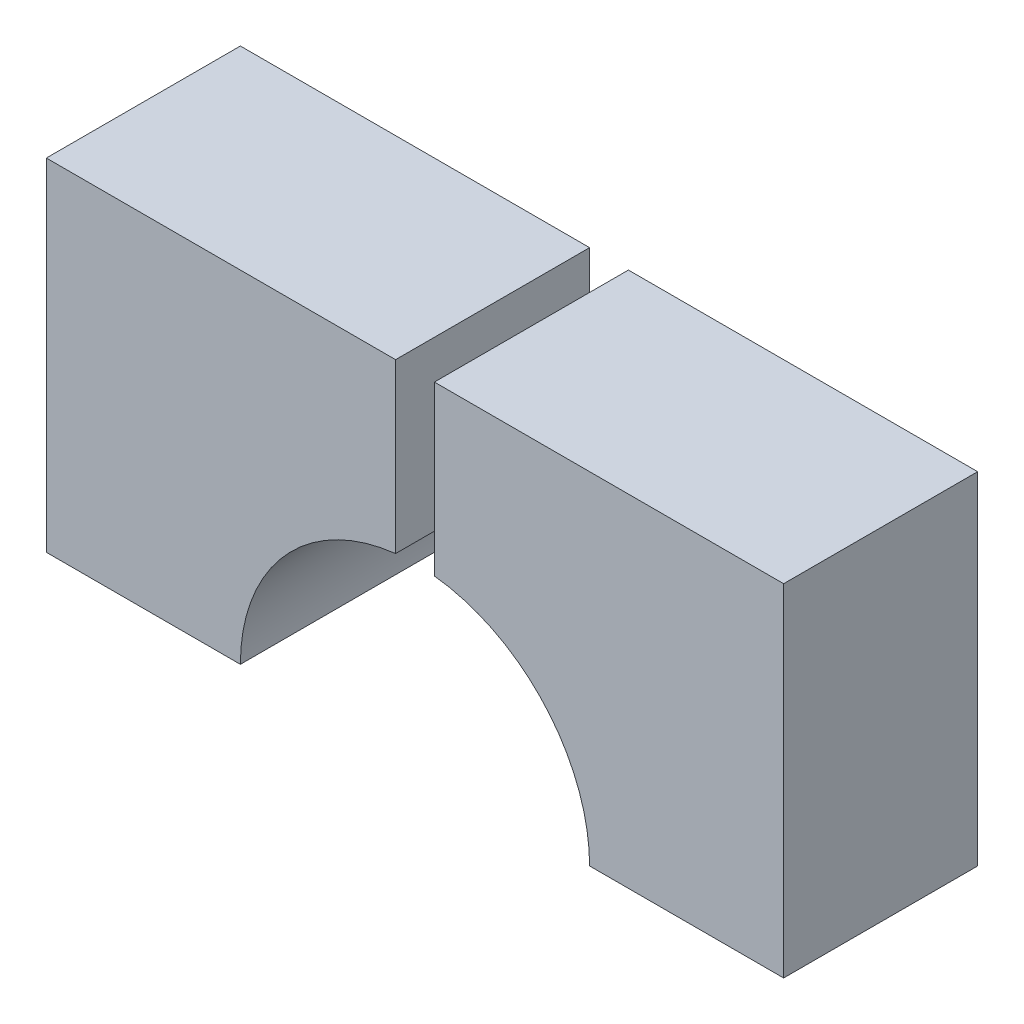
ISO-10303-21;
HEADER;
FILE_DESCRIPTION(('STEP AP214'),'2;1');
FILE_NAME('part.step','',(''),(''),'','','');
FILE_SCHEMA(('AUTOMOTIVE_DESIGN { 1 0 10303 214 1 1 1 1 }'));
ENDSEC;
DATA;
#1=APPLICATION_CONTEXT('core data for automotive mechanical design processes');
#2=APPLICATION_PROTOCOL_DEFINITION('international standard','automotive_design',2000,#1);
#3=PRODUCT_CONTEXT('',#1,'mechanical');
#4=PRODUCT('Part','Part','',(#3));
#5=PRODUCT_RELATED_PRODUCT_CATEGORY('part','',(#4));
#6=PRODUCT_DEFINITION_FORMATION('','',#4);
#7=PRODUCT_DEFINITION_CONTEXT('part definition',#1,'design');
#8=PRODUCT_DEFINITION('design','',#6,#7);
#9=PRODUCT_DEFINITION_SHAPE('','',#8);
#10=(LENGTH_UNIT() NAMED_UNIT(*) SI_UNIT(.MILLI.,.METRE.));
#11=(NAMED_UNIT(*) PLANE_ANGLE_UNIT() SI_UNIT($,.RADIAN.));
#12=(NAMED_UNIT(*) SI_UNIT($,.STERADIAN.) SOLID_ANGLE_UNIT());
#13=UNCERTAINTY_MEASURE_WITH_UNIT(LENGTH_MEASURE(1.E-05),#10,'distance_accuracy_value','');
#14=(GEOMETRIC_REPRESENTATION_CONTEXT(3) GLOBAL_UNCERTAINTY_ASSIGNED_CONTEXT((#13)) GLOBAL_UNIT_ASSIGNED_CONTEXT((#10,
#11,#12)) REPRESENTATION_CONTEXT('',''));
#15=CARTESIAN_POINT('',(0.,0.,0.));
#16=DIRECTION('',(0.,0.,1.));
#17=DIRECTION('',(1.,0.,0.));
#18=AXIS2_PLACEMENT_3D('',#15,#16,#17);
#19=CARTESIAN_POINT('',(-2.0574750877524E-12,-505.650336196322,-130.));
#20=DIRECTION('',(0.,0.,1.));
#21=DIRECTION('',(-1.,0.,0.));
#22=AXIS2_PLACEMENT_3D('',#19,#20,#21);
#23=CYLINDRICAL_SURFACE('',#22,90.);
#24=CARTESIAN_POINT('',(-2.0574750877524E-12,-505.650336196322,-30.));
#25=DIRECTION('',(0.,0.,-1.));
#26=DIRECTION('',(-1.,0.,0.));
#27=AXIS2_PLACEMENT_3D('',#24,#25,#26);
#28=CIRCLE('',#27,90.);
#29=CARTESIAN_POINT('',(-90.0000000000021,-505.650336196322,-30.));
#30=VERTEX_POINT('',#29);
#31=CARTESIAN_POINT('',(-10.0000000000021,-416.20761709633,-30.));
#32=VERTEX_POINT('',#31);
#33=EDGE_CURVE('E120',#30,#32,#28,.T.);
#34=ORIENTED_EDGE('',*,*,#33,.F.);
#35=DIRECTION('',(0.,0.,1.));
#36=VECTOR('',#35,1.);
#37=CARTESIAN_POINT('',(-90.0000000000021,-505.650336196322,-130.));
#38=LINE('',#37,#36);
#39=CARTESIAN_POINT('',(-90.0000000000021,-505.650336196322,-130.));
#40=VERTEX_POINT('',#39);
#41=EDGE_CURVE('E48',#40,#30,#38,.T.);
#42=ORIENTED_EDGE('',*,*,#41,.F.);
#43=CARTESIAN_POINT('',(-2.0574750877524E-12,-505.650336196322,-130.));
#44=DIRECTION('',(0.,0.,-1.));
#45=DIRECTION('',(-1.,0.,0.));
#46=AXIS2_PLACEMENT_3D('',#43,#44,#45);
#47=CIRCLE('',#46,90.);
#48=CARTESIAN_POINT('',(-10.0000000000021,-416.20761709633,-130.));
#49=VERTEX_POINT('',#48);
#50=EDGE_CURVE('E127',#40,#49,#47,.T.);
#51=ORIENTED_EDGE('',*,*,#50,.T.);
#52=DIRECTION('',(0.,0.,1.));
#53=VECTOR('',#52,1.);
#54=CARTESIAN_POINT('',(-10.0000000000021,-416.20761709633,-130.));
#55=LINE('',#54,#53);
#56=EDGE_CURVE('E12',#49,#32,#55,.T.);
#57=ORIENTED_EDGE('',*,*,#56,.T.);
#58=EDGE_LOOP('',(#34,#42,#51,#57));
#59=FACE_BOUND('',#58,.T.);
#60=ADVANCED_FACE('F45',(#59),#23,.F.);
#61=CARTESIAN_POINT('',(-10.0000000000021,0.,-130.));
#62=DIRECTION('',(-1.,0.,0.));
#63=DIRECTION('',(0.,0.,-1.));
#64=AXIS2_PLACEMENT_3D('',#61,#62,#63);
#65=PLANE('',#64);
#66=DIRECTION('',(0.,1.,0.));
#67=VECTOR('',#66,1.);
#68=CARTESIAN_POINT('',(-10.0000000000021,0.,-30.));
#69=LINE('',#68,#67);
#70=CARTESIAN_POINT('',(-10.0000000000021,-329.650336196322,-30.));
#71=VERTEX_POINT('',#70);
#72=EDGE_CURVE('E89',#32,#71,#69,.T.);
#73=ORIENTED_EDGE('',*,*,#72,.F.);
#74=ORIENTED_EDGE('',*,*,#56,.F.);
#75=DIRECTION('',(0.,1.,0.));
#76=VECTOR('',#75,1.);
#77=CARTESIAN_POINT('',(-10.0000000000021,0.,-130.));
#78=LINE('',#77,#76);
#79=CARTESIAN_POINT('',(-10.0000000000021,-329.650336196322,-130.));
#80=VERTEX_POINT('',#79);
#81=EDGE_CURVE('E63',#49,#80,#78,.T.);
#82=ORIENTED_EDGE('',*,*,#81,.T.);
#83=DIRECTION('',(0.,0.,1.));
#84=VECTOR('',#83,1.);
#85=CARTESIAN_POINT('',(-10.0000000000021,-329.650336196322,-130.));
#86=LINE('',#85,#84);
#87=EDGE_CURVE('E54',#80,#71,#86,.T.);
#88=ORIENTED_EDGE('',*,*,#87,.T.);
#89=EDGE_LOOP('',(#73,#74,#82,#88));
#90=FACE_BOUND('',#89,.T.);
#91=ADVANCED_FACE('F144',(#90),#65,.F.);
#92=CARTESIAN_POINT('',(0.,-329.650336196322,-130.));
#93=DIRECTION('',(0.,1.,0.));
#94=DIRECTION('',(1.,0.,0.));
#95=AXIS2_PLACEMENT_3D('',#92,#93,#94);
#96=PLANE('',#95);
#97=DIRECTION('',(1.,0.,0.));
#98=VECTOR('',#97,1.);
#99=CARTESIAN_POINT('',(0.,-329.650336196322,-30.));
#100=LINE('',#99,#98);
#101=CARTESIAN_POINT('',(-190.000000000002,-329.650336196322,-30.));
#102=VERTEX_POINT('',#101);
#103=EDGE_CURVE('E83',#102,#71,#100,.T.);
#104=ORIENTED_EDGE('',*,*,#103,.T.);
#105=ORIENTED_EDGE('',*,*,#87,.F.);
#106=DIRECTION('',(1.,0.,0.));
#107=VECTOR('',#106,1.);
#108=CARTESIAN_POINT('',(0.,-329.650336196322,-130.));
#109=LINE('',#108,#107);
#110=CARTESIAN_POINT('',(-190.000000000002,-329.650336196322,-130.));
#111=VERTEX_POINT('',#110);
#112=EDGE_CURVE('E105',#111,#80,#109,.T.);
#113=ORIENTED_EDGE('',*,*,#112,.F.);
#114=DIRECTION('',(0.,0.,1.));
#115=VECTOR('',#114,1.);
#116=CARTESIAN_POINT('',(-190.000000000002,-329.650336196322,-130.));
#117=LINE('',#116,#115);
#118=EDGE_CURVE('E109',#111,#102,#117,.T.);
#119=ORIENTED_EDGE('',*,*,#118,.T.);
#120=EDGE_LOOP('',(#104,#105,#113,#119));
#121=FACE_BOUND('',#120,.T.);
#122=ADVANCED_FACE('F115',(#121),#96,.T.);
#123=CARTESIAN_POINT('',(-190.000000000002,0.,-130.));
#124=DIRECTION('',(-1.,0.,0.));
#125=DIRECTION('',(0.,0.,-1.));
#126=AXIS2_PLACEMENT_3D('',#123,#124,#125);
#127=PLANE('',#126);
#128=DIRECTION('',(0.,1.,0.));
#129=VECTOR('',#128,1.);
#130=CARTESIAN_POINT('',(-190.000000000002,0.,-30.));
#131=LINE('',#130,#129);
#132=CARTESIAN_POINT('',(-190.000000000002,-505.650336196322,-30.));
#133=VERTEX_POINT('',#132);
#134=EDGE_CURVE('E112',#133,#102,#131,.T.);
#135=ORIENTED_EDGE('',*,*,#134,.T.);
#136=ORIENTED_EDGE('',*,*,#118,.F.);
#137=DIRECTION('',(0.,1.,0.));
#138=VECTOR('',#137,1.);
#139=CARTESIAN_POINT('',(-190.000000000002,0.,-130.));
#140=LINE('',#139,#138);
#141=CARTESIAN_POINT('',(-190.000000000002,-505.650336196322,-130.));
#142=VERTEX_POINT('',#141);
#143=EDGE_CURVE('E101',#142,#111,#140,.T.);
#144=ORIENTED_EDGE('',*,*,#143,.F.);
#145=DIRECTION('',(0.,0.,1.));
#146=VECTOR('',#145,1.);
#147=CARTESIAN_POINT('',(-190.000000000002,-505.650336196322,-130.));
#148=LINE('',#147,#146);
#149=EDGE_CURVE('E113',#142,#133,#148,.T.);
#150=ORIENTED_EDGE('',*,*,#149,.T.);
#151=EDGE_LOOP('',(#135,#136,#144,#150));
#152=FACE_BOUND('',#151,.T.);
#153=ADVANCED_FACE('F110',(#152),#127,.T.);
#154=CARTESIAN_POINT('',(-1.47732801488053E-13,-505.650336196322,-130.));
#155=DIRECTION('',(0.,1.,0.));
#156=DIRECTION('',(1.,0.,0.));
#157=AXIS2_PLACEMENT_3D('',#154,#155,#156);
#158=PLANE('',#157);
#159=DIRECTION('',(1.,0.,0.));
#160=VECTOR('',#159,1.);
#161=CARTESIAN_POINT('',(-1.47732801488053E-13,-505.650336196322,-30.));
#162=LINE('',#161,#160);
#163=EDGE_CURVE('E123',#133,#30,#162,.T.);
#164=ORIENTED_EDGE('',*,*,#163,.F.);
#165=ORIENTED_EDGE('',*,*,#149,.F.);
#166=DIRECTION('',(1.,0.,0.));
#167=VECTOR('',#166,1.);
#168=CARTESIAN_POINT('',(-1.47732801488053E-13,-505.650336196322,-130.));
#169=LINE('',#168,#167);
#170=EDGE_CURVE('E97',#142,#40,#169,.T.);
#171=ORIENTED_EDGE('',*,*,#170,.T.);
#172=ORIENTED_EDGE('',*,*,#41,.T.);
#173=EDGE_LOOP('',(#164,#165,#171,#172));
#174=FACE_BOUND('',#173,.T.);
#175=ADVANCED_FACE('F131',(#174),#158,.F.);
#176=CARTESIAN_POINT('',(0.,0.,-130.));
#177=DIRECTION('',(0.,0.,1.));
#178=DIRECTION('',(-1.,0.,0.));
#179=AXIS2_PLACEMENT_3D('',#176,#177,#178);
#180=PLANE('',#179);
#181=ORIENTED_EDGE('',*,*,#50,.F.);
#182=ORIENTED_EDGE('',*,*,#170,.F.);
#183=ORIENTED_EDGE('',*,*,#143,.T.);
#184=ORIENTED_EDGE('',*,*,#112,.T.);
#185=ORIENTED_EDGE('',*,*,#81,.F.);
#186=EDGE_LOOP('',(#181,#182,#183,#184,#185));
#187=FACE_BOUND('',#186,.T.);
#188=ADVANCED_FACE('F103',(#187),#180,.F.);
#189=CARTESIAN_POINT('',(0.,0.,-30.));
#190=DIRECTION('',(0.,0.,1.));
#191=DIRECTION('',(-1.,0.,0.));
#192=AXIS2_PLACEMENT_3D('',#189,#190,#191);
#193=PLANE('',#192);
#194=ORIENTED_EDGE('',*,*,#33,.T.);
#195=ORIENTED_EDGE('',*,*,#72,.T.);
#196=ORIENTED_EDGE('',*,*,#103,.F.);
#197=ORIENTED_EDGE('',*,*,#134,.F.);
#198=ORIENTED_EDGE('',*,*,#163,.T.);
#199=EDGE_LOOP('',(#194,#195,#196,#197,#198));
#200=FACE_BOUND('',#199,.T.);
#201=ADVANCED_FACE('F135',(#200),#193,.T.);
#202=CLOSED_SHELL('',(#60,#91,#122,#153,#175,#188,#201));
#203=MANIFOLD_SOLID_BREP('B2',#202);
#204=CARTESIAN_POINT('',(2.0574750877524E-12,-505.650336196322,-130.));
#205=DIRECTION('',(0.,0.,1.));
#206=DIRECTION('',(1.,0.,0.));
#207=AXIS2_PLACEMENT_3D('',#204,#205,#206);
#208=CYLINDRICAL_SURFACE('',#207,90.);
#209=CARTESIAN_POINT('',(2.0574750877524E-12,-505.650336196322,-30.));
#210=DIRECTION('',(0.,0.,1.));
#211=DIRECTION('',(1.,0.,0.));
#212=AXIS2_PLACEMENT_3D('',#209,#210,#211);
#213=CIRCLE('',#212,90.);
#214=CARTESIAN_POINT('',(90.0000000000021,-505.650336196322,-30.));
#215=VERTEX_POINT('',#214);
#216=CARTESIAN_POINT('',(10.0000000000021,-416.20761709633,-30.));
#217=VERTEX_POINT('',#216);
#218=EDGE_CURVE('E273',#215,#217,#213,.T.);
#219=ORIENTED_EDGE('',*,*,#218,.T.);
#220=DIRECTION('',(0.,0.,1.));
#221=VECTOR('',#220,1.);
#222=CARTESIAN_POINT('',(10.0000000000021,-416.20761709633,-130.));
#223=LINE('',#222,#221);
#224=CARTESIAN_POINT('',(10.0000000000021,-416.20761709633,-130.));
#225=VERTEX_POINT('',#224);
#226=EDGE_CURVE('E43',#225,#217,#223,.T.);
#227=ORIENTED_EDGE('',*,*,#226,.F.);
#228=CARTESIAN_POINT('',(2.0574750877524E-12,-505.650336196322,-130.));
#229=DIRECTION('',(0.,0.,1.));
#230=DIRECTION('',(1.,0.,0.));
#231=AXIS2_PLACEMENT_3D('',#228,#229,#230);
#232=CIRCLE('',#231,90.);
#233=CARTESIAN_POINT('',(90.0000000000021,-505.650336196322,-130.));
#234=VERTEX_POINT('',#233);
#235=EDGE_CURVE('E268',#234,#225,#232,.T.);
#236=ORIENTED_EDGE('',*,*,#235,.F.);
#237=DIRECTION('',(0.,0.,1.));
#238=VECTOR('',#237,1.);
#239=CARTESIAN_POINT('',(90.0000000000021,-505.650336196322,-130.));
#240=LINE('',#239,#238);
#241=EDGE_CURVE('E201',#234,#215,#240,.T.);
#242=ORIENTED_EDGE('',*,*,#241,.T.);
#243=EDGE_LOOP('',(#219,#227,#236,#242));
#244=FACE_BOUND('',#243,.T.);
#245=ADVANCED_FACE('F198',(#244),#208,.F.);
#246=CARTESIAN_POINT('',(10.0000000000021,0.,-130.));
#247=DIRECTION('',(1.,0.,0.));
#248=DIRECTION('',(0.,0.,-1.));
#249=AXIS2_PLACEMENT_3D('',#246,#247,#248);
#250=PLANE('',#249);
#251=DIRECTION('',(0.,1.,0.));
#252=VECTOR('',#251,1.);
#253=CARTESIAN_POINT('',(10.0000000000021,0.,-30.));
#254=LINE('',#253,#252);
#255=CARTESIAN_POINT('',(10.0000000000021,-329.650336196322,-30.));
#256=VERTEX_POINT('',#255);
#257=EDGE_CURVE('E240',#217,#256,#254,.T.);
#258=ORIENTED_EDGE('',*,*,#257,.T.);
#259=DIRECTION('',(0.,0.,1.));
#260=VECTOR('',#259,1.);
#261=CARTESIAN_POINT('',(10.0000000000021,-329.650336196322,-130.));
#262=LINE('',#261,#260);
#263=CARTESIAN_POINT('',(10.0000000000021,-329.650336196322,-130.));
#264=VERTEX_POINT('',#263);
#265=EDGE_CURVE('E207',#264,#256,#262,.T.);
#266=ORIENTED_EDGE('',*,*,#265,.F.);
#267=DIRECTION('',(0.,1.,0.));
#268=VECTOR('',#267,1.);
#269=CARTESIAN_POINT('',(10.0000000000021,0.,-130.));
#270=LINE('',#269,#268);
#271=EDGE_CURVE('E215',#225,#264,#270,.T.);
#272=ORIENTED_EDGE('',*,*,#271,.F.);
#273=ORIENTED_EDGE('',*,*,#226,.T.);
#274=EDGE_LOOP('',(#258,#266,#272,#273));
#275=FACE_BOUND('',#274,.T.);
#276=ADVANCED_FACE('F298',(#275),#250,.F.);
#277=CARTESIAN_POINT('',(0.,-329.650336196322,-130.));
#278=DIRECTION('',(0.,1.,0.));
#279=DIRECTION('',(-1.,0.,0.));
#280=AXIS2_PLACEMENT_3D('',#277,#278,#279);
#281=PLANE('',#280);
#282=DIRECTION('',(-1.,0.,0.));
#283=VECTOR('',#282,1.);
#284=CARTESIAN_POINT('',(0.,-329.650336196322,-30.));
#285=LINE('',#284,#283);
#286=CARTESIAN_POINT('',(190.000000000002,-329.650336196322,-30.));
#287=VERTEX_POINT('',#286);
#288=EDGE_CURVE('E256',#287,#256,#285,.T.);
#289=ORIENTED_EDGE('',*,*,#288,.F.);
#290=DIRECTION('',(0.,0.,1.));
#291=VECTOR('',#290,1.);
#292=CARTESIAN_POINT('',(190.000000000002,-329.650336196322,-130.));
#293=LINE('',#292,#291);
#294=CARTESIAN_POINT('',(190.000000000002,-329.650336196322,-130.));
#295=VERTEX_POINT('',#294);
#296=EDGE_CURVE('E252',#295,#287,#293,.T.);
#297=ORIENTED_EDGE('',*,*,#296,.F.);
#298=DIRECTION('',(-1.,0.,0.));
#299=VECTOR('',#298,1.);
#300=CARTESIAN_POINT('',(0.,-329.650336196322,-130.));
#301=LINE('',#300,#299);
#302=EDGE_CURVE('E255',#295,#264,#301,.T.);
#303=ORIENTED_EDGE('',*,*,#302,.T.);
#304=ORIENTED_EDGE('',*,*,#265,.T.);
#305=EDGE_LOOP('',(#289,#297,#303,#304));
#306=FACE_BOUND('',#305,.T.);
#307=ADVANCED_FACE('F254',(#306),#281,.T.);
#308=CARTESIAN_POINT('',(190.000000000002,0.,-130.));
#309=DIRECTION('',(1.,0.,0.));
#310=DIRECTION('',(0.,0.,-1.));
#311=AXIS2_PLACEMENT_3D('',#308,#309,#310);
#312=PLANE('',#311);
#313=DIRECTION('',(0.,1.,0.));
#314=VECTOR('',#313,1.);
#315=CARTESIAN_POINT('',(190.000000000002,0.,-30.));
#316=LINE('',#315,#314);
#317=CARTESIAN_POINT('',(190.000000000002,-505.650336196322,-30.));
#318=VERTEX_POINT('',#317);
#319=EDGE_CURVE('E278',#318,#287,#316,.T.);
#320=ORIENTED_EDGE('',*,*,#319,.F.);
#321=DIRECTION('',(0.,0.,1.));
#322=VECTOR('',#321,1.);
#323=CARTESIAN_POINT('',(190.000000000002,-505.650336196322,-130.));
#324=LINE('',#323,#322);
#325=CARTESIAN_POINT('',(190.000000000002,-505.650336196322,-130.));
#326=VERTEX_POINT('',#325);
#327=EDGE_CURVE('E261',#326,#318,#324,.T.);
#328=ORIENTED_EDGE('',*,*,#327,.F.);
#329=DIRECTION('',(0.,1.,0.));
#330=VECTOR('',#329,1.);
#331=CARTESIAN_POINT('',(190.000000000002,0.,-130.));
#332=LINE('',#331,#330);
#333=EDGE_CURVE('E264',#326,#295,#332,.T.);
#334=ORIENTED_EDGE('',*,*,#333,.T.);
#335=ORIENTED_EDGE('',*,*,#296,.T.);
#336=EDGE_LOOP('',(#320,#328,#334,#335));
#337=FACE_BOUND('',#336,.T.);
#338=ADVANCED_FACE('F266',(#337),#312,.T.);
#339=CARTESIAN_POINT('',(1.47732801488053E-13,-505.650336196322,-130.));
#340=DIRECTION('',(0.,1.,0.));
#341=DIRECTION('',(-1.,0.,0.));
#342=AXIS2_PLACEMENT_3D('',#339,#340,#341);
#343=PLANE('',#342);
#344=DIRECTION('',(-1.,0.,0.));
#345=VECTOR('',#344,1.);
#346=CARTESIAN_POINT('',(1.47732801488053E-13,-505.650336196322,-30.));
#347=LINE('',#346,#345);
#348=EDGE_CURVE('E276',#318,#215,#347,.T.);
#349=ORIENTED_EDGE('',*,*,#348,.T.);
#350=ORIENTED_EDGE('',*,*,#241,.F.);
#351=DIRECTION('',(-1.,0.,0.));
#352=VECTOR('',#351,1.);
#353=CARTESIAN_POINT('',(1.47732801488053E-13,-505.650336196322,-130.));
#354=LINE('',#353,#352);
#355=EDGE_CURVE('E247',#326,#234,#354,.T.);
#356=ORIENTED_EDGE('',*,*,#355,.F.);
#357=ORIENTED_EDGE('',*,*,#327,.T.);
#358=EDGE_LOOP('',(#349,#350,#356,#357));
#359=FACE_BOUND('',#358,.T.);
#360=ADVANCED_FACE('F289',(#359),#343,.F.);
#361=CARTESIAN_POINT('',(0.,0.,-130.));
#362=DIRECTION('',(0.,0.,1.));
#363=DIRECTION('',(1.,0.,0.));
#364=AXIS2_PLACEMENT_3D('',#361,#362,#363);
#365=PLANE('',#364);
#366=ORIENTED_EDGE('',*,*,#235,.T.);
#367=ORIENTED_EDGE('',*,*,#271,.T.);
#368=ORIENTED_EDGE('',*,*,#302,.F.);
#369=ORIENTED_EDGE('',*,*,#333,.F.);
#370=ORIENTED_EDGE('',*,*,#355,.T.);
#371=EDGE_LOOP('',(#366,#367,#368,#369,#370));
#372=FACE_BOUND('',#371,.T.);
#373=ADVANCED_FACE('F263',(#372),#365,.F.);
#374=CARTESIAN_POINT('',(0.,0.,-30.));
#375=DIRECTION('',(0.,0.,1.));
#376=DIRECTION('',(1.,0.,0.));
#377=AXIS2_PLACEMENT_3D('',#374,#375,#376);
#378=PLANE('',#377);
#379=ORIENTED_EDGE('',*,*,#218,.F.);
#380=ORIENTED_EDGE('',*,*,#348,.F.);
#381=ORIENTED_EDGE('',*,*,#319,.T.);
#382=ORIENTED_EDGE('',*,*,#288,.T.);
#383=ORIENTED_EDGE('',*,*,#257,.F.);
#384=EDGE_LOOP('',(#379,#380,#381,#382,#383));
#385=FACE_BOUND('',#384,.T.);
#386=ADVANCED_FACE('F288',(#385),#378,.T.);
#387=CLOSED_SHELL('',(#245,#276,#307,#338,#360,#373,#386));
#388=MANIFOLD_SOLID_BREP('B6',#387);
#389=ADVANCED_BREP_SHAPE_REPRESENTATION('',(#18,#203,#388),#14);
#390=SHAPE_DEFINITION_REPRESENTATION(#9,#389);
ENDSEC;
END-ISO-10303-21;
